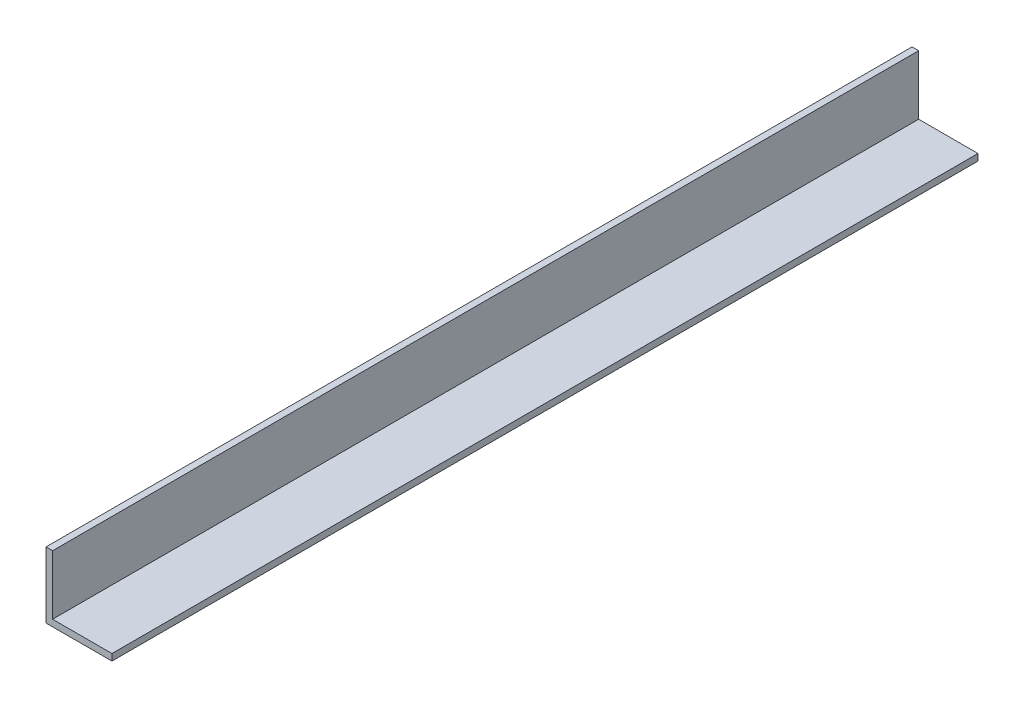
ISO-10303-21;
HEADER;
FILE_DESCRIPTION(('STEP AP214'),'2;1');
FILE_NAME('part.step','',(''),(''),'','','');
FILE_SCHEMA(('AUTOMOTIVE_DESIGN { 1 0 10303 214 1 1 1 1 }'));
ENDSEC;
DATA;
#1=APPLICATION_CONTEXT('core data for automotive mechanical design processes');
#2=APPLICATION_PROTOCOL_DEFINITION('international standard','automotive_design',2000,#1);
#3=PRODUCT_CONTEXT('',#1,'mechanical');
#4=PRODUCT('Part','Part','',(#3));
#5=PRODUCT_RELATED_PRODUCT_CATEGORY('part','',(#4));
#6=PRODUCT_DEFINITION_FORMATION('','',#4);
#7=PRODUCT_DEFINITION_CONTEXT('part definition',#1,'design');
#8=PRODUCT_DEFINITION('design','',#6,#7);
#9=PRODUCT_DEFINITION_SHAPE('','',#8);
#10=(LENGTH_UNIT() NAMED_UNIT(*) SI_UNIT(.MILLI.,.METRE.));
#11=(NAMED_UNIT(*) PLANE_ANGLE_UNIT() SI_UNIT($,.RADIAN.));
#12=(NAMED_UNIT(*) SI_UNIT($,.STERADIAN.) SOLID_ANGLE_UNIT());
#13=UNCERTAINTY_MEASURE_WITH_UNIT(LENGTH_MEASURE(1.E-05),#10,'distance_accuracy_value','');
#14=(GEOMETRIC_REPRESENTATION_CONTEXT(3) GLOBAL_UNCERTAINTY_ASSIGNED_CONTEXT((#13)) GLOBAL_UNIT_ASSIGNED_CONTEXT((#10,
#11,#12)) REPRESENTATION_CONTEXT('',''));
#15=CARTESIAN_POINT('',(0.,0.,0.));
#16=DIRECTION('',(0.,0.,1.));
#17=DIRECTION('',(1.,0.,0.));
#18=AXIS2_PLACEMENT_3D('',#15,#16,#17);
#19=CARTESIAN_POINT('',(3.,30.,394.));
#20=DIRECTION('',(0.,-1.,0.));
#21=DIRECTION('',(0.,0.,-1.));
#22=AXIS2_PLACEMENT_3D('',#19,#20,#21);
#23=PLANE('',#22);
#24=DIRECTION('',(-1.,0.,0.));
#25=VECTOR('',#24,1.);
#26=CARTESIAN_POINT('',(3.,30.,0.));
#27=LINE('',#26,#25);
#28=CARTESIAN_POINT('',(3.,30.,0.));
#29=VERTEX_POINT('',#28);
#30=CARTESIAN_POINT('',(0.,30.,0.));
#31=VERTEX_POINT('',#30);
#32=EDGE_CURVE('E117',#29,#31,#27,.T.);
#33=ORIENTED_EDGE('',*,*,#32,.T.);
#34=DIRECTION('',(0.,0.,-1.));
#35=VECTOR('',#34,1.);
#36=CARTESIAN_POINT('',(0.,30.,394.));
#37=LINE('',#36,#35);
#38=CARTESIAN_POINT('',(0.,30.,394.));
#39=VERTEX_POINT('',#38);
#40=EDGE_CURVE('E11',#39,#31,#37,.T.);
#41=ORIENTED_EDGE('',*,*,#40,.F.);
#42=DIRECTION('',(-1.,0.,0.));
#43=VECTOR('',#42,1.);
#44=CARTESIAN_POINT('',(3.,30.,394.));
#45=LINE('',#44,#43);
#46=CARTESIAN_POINT('',(3.,30.,394.));
#47=VERTEX_POINT('',#46);
#48=EDGE_CURVE('E127',#47,#39,#45,.T.);
#49=ORIENTED_EDGE('',*,*,#48,.F.);
#50=DIRECTION('',(0.,0.,-1.));
#51=VECTOR('',#50,1.);
#52=CARTESIAN_POINT('',(3.,30.,394.));
#53=LINE('',#52,#51);
#54=EDGE_CURVE('E113',#47,#29,#53,.T.);
#55=ORIENTED_EDGE('',*,*,#54,.T.);
#56=EDGE_LOOP('',(#33,#41,#49,#55));
#57=FACE_BOUND('',#56,.T.);
#58=ADVANCED_FACE('F33',(#57),#23,.F.);
#59=CARTESIAN_POINT('',(0.,30.,394.));
#60=DIRECTION('',(1.,0.,0.));
#61=DIRECTION('',(0.,0.,-1.));
#62=AXIS2_PLACEMENT_3D('',#59,#60,#61);
#63=PLANE('',#62);
#64=DIRECTION('',(0.,-1.,0.));
#65=VECTOR('',#64,1.);
#66=CARTESIAN_POINT('',(0.,30.,0.));
#67=LINE('',#66,#65);
#68=CARTESIAN_POINT('',(0.,0.,0.));
#69=VERTEX_POINT('',#68);
#70=EDGE_CURVE('E120',#31,#69,#67,.T.);
#71=ORIENTED_EDGE('',*,*,#70,.T.);
#72=DIRECTION('',(0.,0.,-1.));
#73=VECTOR('',#72,1.);
#74=CARTESIAN_POINT('',(0.,0.,394.));
#75=LINE('',#74,#73);
#76=CARTESIAN_POINT('',(0.,0.,394.));
#77=VERTEX_POINT('',#76);
#78=EDGE_CURVE('E41',#77,#69,#75,.T.);
#79=ORIENTED_EDGE('',*,*,#78,.F.);
#80=DIRECTION('',(0.,-1.,0.));
#81=VECTOR('',#80,1.);
#82=CARTESIAN_POINT('',(0.,30.,394.));
#83=LINE('',#82,#81);
#84=EDGE_CURVE('E86',#39,#77,#83,.T.);
#85=ORIENTED_EDGE('',*,*,#84,.F.);
#86=ORIENTED_EDGE('',*,*,#40,.T.);
#87=EDGE_LOOP('',(#71,#79,#85,#86));
#88=FACE_BOUND('',#87,.T.);
#89=ADVANCED_FACE('F151',(#88),#63,.F.);
#90=CARTESIAN_POINT('',(0.,0.,394.));
#91=DIRECTION('',(0.,1.,0.));
#92=DIRECTION('',(0.,0.,1.));
#93=AXIS2_PLACEMENT_3D('',#90,#91,#92);
#94=PLANE('',#93);
#95=DIRECTION('',(1.,0.,0.));
#96=VECTOR('',#95,1.);
#97=CARTESIAN_POINT('',(0.,0.,0.));
#98=LINE('',#97,#96);
#99=CARTESIAN_POINT('',(30.,0.,0.));
#100=VERTEX_POINT('',#99);
#101=EDGE_CURVE('E122',#69,#100,#98,.T.);
#102=ORIENTED_EDGE('',*,*,#101,.T.);
#103=DIRECTION('',(0.,0.,-1.));
#104=VECTOR('',#103,1.);
#105=CARTESIAN_POINT('',(30.,0.,394.));
#106=LINE('',#105,#104);
#107=CARTESIAN_POINT('',(30.,0.,394.));
#108=VERTEX_POINT('',#107);
#109=EDGE_CURVE('E108',#108,#100,#106,.T.);
#110=ORIENTED_EDGE('',*,*,#109,.F.);
#111=DIRECTION('',(1.,0.,0.));
#112=VECTOR('',#111,1.);
#113=CARTESIAN_POINT('',(0.,0.,394.));
#114=LINE('',#113,#112);
#115=EDGE_CURVE('E99',#77,#108,#114,.T.);
#116=ORIENTED_EDGE('',*,*,#115,.F.);
#117=ORIENTED_EDGE('',*,*,#78,.T.);
#118=EDGE_LOOP('',(#102,#110,#116,#117));
#119=FACE_BOUND('',#118,.T.);
#120=ADVANCED_FACE('F133',(#119),#94,.F.);
#121=CARTESIAN_POINT('',(30.,0.,394.));
#122=DIRECTION('',(-1.,0.,0.));
#123=DIRECTION('',(0.,0.,1.));
#124=AXIS2_PLACEMENT_3D('',#121,#122,#123);
#125=PLANE('',#124);
#126=DIRECTION('',(0.,1.,0.));
#127=VECTOR('',#126,1.);
#128=CARTESIAN_POINT('',(30.,0.,0.));
#129=LINE('',#128,#127);
#130=CARTESIAN_POINT('',(30.,3.,0.));
#131=VERTEX_POINT('',#130);
#132=EDGE_CURVE('E107',#100,#131,#129,.T.);
#133=ORIENTED_EDGE('',*,*,#132,.T.);
#134=DIRECTION('',(0.,0.,-1.));
#135=VECTOR('',#134,1.);
#136=CARTESIAN_POINT('',(30.,3.,394.));
#137=LINE('',#136,#135);
#138=CARTESIAN_POINT('',(30.,3.,394.));
#139=VERTEX_POINT('',#138);
#140=EDGE_CURVE('E104',#139,#131,#137,.T.);
#141=ORIENTED_EDGE('',*,*,#140,.F.);
#142=DIRECTION('',(0.,1.,0.));
#143=VECTOR('',#142,1.);
#144=CARTESIAN_POINT('',(30.,0.,394.));
#145=LINE('',#144,#143);
#146=EDGE_CURVE('E93',#108,#139,#145,.T.);
#147=ORIENTED_EDGE('',*,*,#146,.F.);
#148=ORIENTED_EDGE('',*,*,#109,.T.);
#149=EDGE_LOOP('',(#133,#141,#147,#148));
#150=FACE_BOUND('',#149,.T.);
#151=ADVANCED_FACE('F105',(#150),#125,.F.);
#152=CARTESIAN_POINT('',(30.,3.,394.));
#153=DIRECTION('',(0.,-1.,0.));
#154=DIRECTION('',(1.,0.,0.));
#155=AXIS2_PLACEMENT_3D('',#152,#153,#154);
#156=PLANE('',#155);
#157=DIRECTION('',(-1.,0.,0.));
#158=VECTOR('',#157,1.);
#159=CARTESIAN_POINT('',(30.,3.,0.));
#160=LINE('',#159,#158);
#161=CARTESIAN_POINT('',(3.,3.,0.));
#162=VERTEX_POINT('',#161);
#163=EDGE_CURVE('E72',#131,#162,#160,.T.);
#164=ORIENTED_EDGE('',*,*,#163,.T.);
#165=DIRECTION('',(0.,0.,-1.));
#166=VECTOR('',#165,1.);
#167=CARTESIAN_POINT('',(3.,3.,394.));
#168=LINE('',#167,#166);
#169=CARTESIAN_POINT('',(3.,3.,394.));
#170=VERTEX_POINT('',#169);
#171=EDGE_CURVE('E109',#170,#162,#168,.T.);
#172=ORIENTED_EDGE('',*,*,#171,.F.);
#173=DIRECTION('',(-1.,0.,0.));
#174=VECTOR('',#173,1.);
#175=CARTESIAN_POINT('',(30.,3.,394.));
#176=LINE('',#175,#174);
#177=EDGE_CURVE('E97',#139,#170,#176,.T.);
#178=ORIENTED_EDGE('',*,*,#177,.F.);
#179=ORIENTED_EDGE('',*,*,#140,.T.);
#180=EDGE_LOOP('',(#164,#172,#178,#179));
#181=FACE_BOUND('',#180,.T.);
#182=ADVANCED_FACE('F111',(#181),#156,.F.);
#183=CARTESIAN_POINT('',(3.,3.,394.));
#184=DIRECTION('',(-1.,0.,0.));
#185=DIRECTION('',(0.,0.,1.));
#186=AXIS2_PLACEMENT_3D('',#183,#184,#185);
#187=PLANE('',#186);
#188=DIRECTION('',(0.,1.,0.));
#189=VECTOR('',#188,1.);
#190=CARTESIAN_POINT('',(3.,3.,0.));
#191=LINE('',#190,#189);
#192=EDGE_CURVE('E78',#162,#29,#191,.T.);
#193=ORIENTED_EDGE('',*,*,#192,.T.);
#194=ORIENTED_EDGE('',*,*,#54,.F.);
#195=DIRECTION('',(0.,1.,0.));
#196=VECTOR('',#195,1.);
#197=CARTESIAN_POINT('',(3.,3.,394.));
#198=LINE('',#197,#196);
#199=EDGE_CURVE('E49',#170,#47,#198,.T.);
#200=ORIENTED_EDGE('',*,*,#199,.F.);
#201=ORIENTED_EDGE('',*,*,#171,.T.);
#202=EDGE_LOOP('',(#193,#194,#200,#201));
#203=FACE_BOUND('',#202,.T.);
#204=ADVANCED_FACE('F140',(#203),#187,.F.);
#205=CARTESIAN_POINT('',(0.,0.,394.));
#206=DIRECTION('',(0.,0.,1.));
#207=DIRECTION('',(1.,0.,0.));
#208=AXIS2_PLACEMENT_3D('',#205,#206,#207);
#209=PLANE('',#208);
#210=ORIENTED_EDGE('',*,*,#48,.T.);
#211=ORIENTED_EDGE('',*,*,#84,.T.);
#212=ORIENTED_EDGE('',*,*,#115,.T.);
#213=ORIENTED_EDGE('',*,*,#146,.T.);
#214=ORIENTED_EDGE('',*,*,#177,.T.);
#215=ORIENTED_EDGE('',*,*,#199,.T.);
#216=EDGE_LOOP('',(#210,#211,#212,#213,#214,#215));
#217=FACE_BOUND('',#216,.T.);
#218=ADVANCED_FACE('F95',(#217),#209,.T.);
#219=CARTESIAN_POINT('',(0.,0.,0.));
#220=DIRECTION('',(0.,0.,1.));
#221=DIRECTION('',(1.,0.,0.));
#222=AXIS2_PLACEMENT_3D('',#219,#220,#221);
#223=PLANE('',#222);
#224=ORIENTED_EDGE('',*,*,#32,.F.);
#225=ORIENTED_EDGE('',*,*,#192,.F.);
#226=ORIENTED_EDGE('',*,*,#163,.F.);
#227=ORIENTED_EDGE('',*,*,#132,.F.);
#228=ORIENTED_EDGE('',*,*,#101,.F.);
#229=ORIENTED_EDGE('',*,*,#70,.F.);
#230=EDGE_LOOP('',(#224,#225,#226,#227,#228,#229));
#231=FACE_BOUND('',#230,.T.);
#232=ADVANCED_FACE('F136',(#231),#223,.F.);
#233=CLOSED_SHELL('',(#58,#89,#120,#151,#182,#204,#218,#232));
#234=MANIFOLD_SOLID_BREP('B2',#233);
#235=ADVANCED_BREP_SHAPE_REPRESENTATION('',(#18,#234),#14);
#236=SHAPE_DEFINITION_REPRESENTATION(#9,#235);
ENDSEC;
END-ISO-10303-21;
